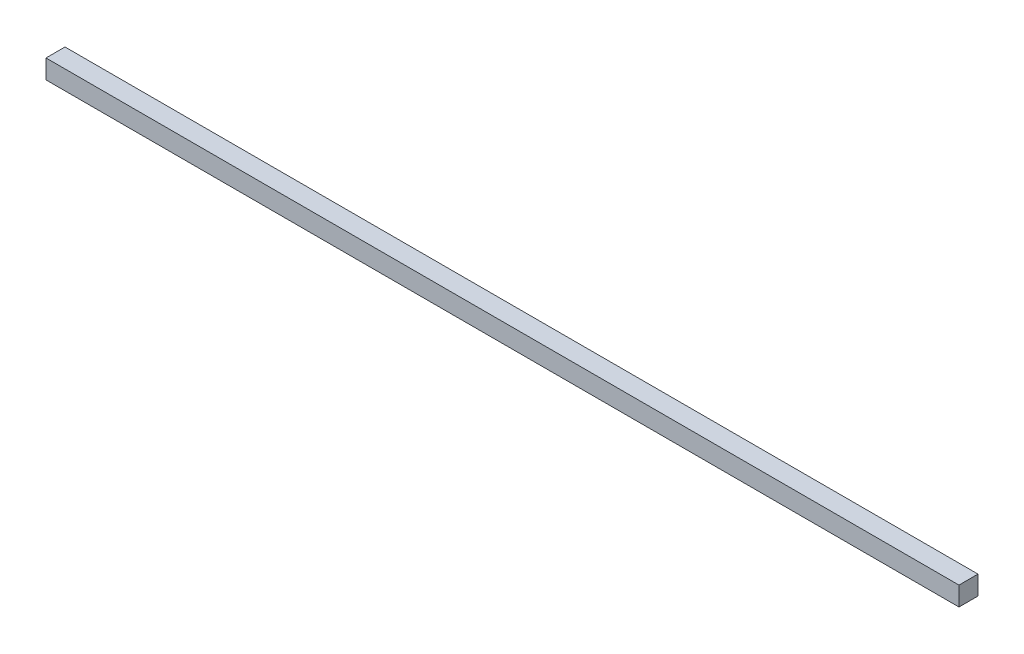
ISO-10303-21;
HEADER;
FILE_DESCRIPTION(('STEP AP214'),'2;1');
FILE_NAME('part.step','',(''),(''),'','','');
FILE_SCHEMA(('AUTOMOTIVE_DESIGN { 1 0 10303 214 1 1 1 1 }'));
ENDSEC;
DATA;
#1=APPLICATION_CONTEXT('core data for automotive mechanical design processes');
#2=APPLICATION_PROTOCOL_DEFINITION('international standard','automotive_design',2000,#1);
#3=PRODUCT_CONTEXT('',#1,'mechanical');
#4=PRODUCT('Part','Part','',(#3));
#5=PRODUCT_RELATED_PRODUCT_CATEGORY('part','',(#4));
#6=PRODUCT_DEFINITION_FORMATION('','',#4);
#7=PRODUCT_DEFINITION_CONTEXT('part definition',#1,'design');
#8=PRODUCT_DEFINITION('design','',#6,#7);
#9=PRODUCT_DEFINITION_SHAPE('','',#8);
#10=(LENGTH_UNIT() NAMED_UNIT(*) SI_UNIT(.MILLI.,.METRE.));
#11=(NAMED_UNIT(*) PLANE_ANGLE_UNIT() SI_UNIT($,.RADIAN.));
#12=(NAMED_UNIT(*) SI_UNIT($,.STERADIAN.) SOLID_ANGLE_UNIT());
#13=UNCERTAINTY_MEASURE_WITH_UNIT(LENGTH_MEASURE(1.E-05),#10,'distance_accuracy_value','');
#14=(GEOMETRIC_REPRESENTATION_CONTEXT(3) GLOBAL_UNCERTAINTY_ASSIGNED_CONTEXT((#13)) GLOBAL_UNIT_ASSIGNED_CONTEXT((#10,
#11,#12)) REPRESENTATION_CONTEXT('',''));
#15=CARTESIAN_POINT('',(0.,0.,0.));
#16=DIRECTION('',(0.,0.,1.));
#17=DIRECTION('',(1.,0.,0.));
#18=AXIS2_PLACEMENT_3D('',#15,#16,#17);
#19=CARTESIAN_POINT('',(0.,57.9960707269154,30.));
#20=DIRECTION('',(1.,0.,0.));
#21=DIRECTION('',(0.,1.,0.));
#22=AXIS2_PLACEMENT_3D('',#19,#20,#21);
#23=PLANE('',#22);
#24=DIRECTION('',(0.,-1.,0.));
#25=VECTOR('',#24,1.);
#26=CARTESIAN_POINT('',(0.,57.9960707269154,0.));
#27=LINE('',#26,#25);
#28=CARTESIAN_POINT('',(0.,57.9960707269154,0.));
#29=VERTEX_POINT('',#28);
#30=CARTESIAN_POINT('',(0.,27.9960707269154,0.));
#31=VERTEX_POINT('',#30);
#32=EDGE_CURVE('E107',#29,#31,#27,.T.);
#33=ORIENTED_EDGE('',*,*,#32,.T.);
#34=DIRECTION('',(0.,0.,-1.));
#35=VECTOR('',#34,1.);
#36=CARTESIAN_POINT('',(0.,27.9960707269154,30.));
#37=LINE('',#36,#35);
#38=CARTESIAN_POINT('',(0.,27.9960707269154,30.));
#39=VERTEX_POINT('',#38);
#40=EDGE_CURVE('E11',#39,#31,#37,.T.);
#41=ORIENTED_EDGE('',*,*,#40,.F.);
#42=DIRECTION('',(0.,-1.,0.));
#43=VECTOR('',#42,1.);
#44=CARTESIAN_POINT('',(0.,57.9960707269154,30.));
#45=LINE('',#44,#43);
#46=CARTESIAN_POINT('',(0.,57.9960707269154,30.));
#47=VERTEX_POINT('',#46);
#48=EDGE_CURVE('E91',#47,#39,#45,.T.);
#49=ORIENTED_EDGE('',*,*,#48,.F.);
#50=DIRECTION('',(0.,0.,-1.));
#51=VECTOR('',#50,1.);
#52=CARTESIAN_POINT('',(0.,57.9960707269154,30.));
#53=LINE('',#52,#51);
#54=EDGE_CURVE('E103',#47,#29,#53,.T.);
#55=ORIENTED_EDGE('',*,*,#54,.T.);
#56=EDGE_LOOP('',(#33,#41,#49,#55));
#57=FACE_BOUND('',#56,.T.);
#58=ADVANCED_FACE('F39',(#57),#23,.F.);
#59=CARTESIAN_POINT('',(0.,27.9960707269154,30.));
#60=DIRECTION('',(0.,1.,0.));
#61=DIRECTION('',(0.,0.,1.));
#62=AXIS2_PLACEMENT_3D('',#59,#60,#61);
#63=PLANE('',#62);
#64=DIRECTION('',(1.,0.,0.));
#65=VECTOR('',#64,1.);
#66=CARTESIAN_POINT('',(0.,27.9960707269154,0.));
#67=LINE('',#66,#65);
#68=CARTESIAN_POINT('',(1440.,27.9960707269154,0.));
#69=VERTEX_POINT('',#68);
#70=EDGE_CURVE('E96',#31,#69,#67,.T.);
#71=ORIENTED_EDGE('',*,*,#70,.T.);
#72=DIRECTION('',(0.,0.,-1.));
#73=VECTOR('',#72,1.);
#74=CARTESIAN_POINT('',(1440.,27.9960707269154,30.));
#75=LINE('',#74,#73);
#76=CARTESIAN_POINT('',(1440.,27.9960707269154,30.));
#77=VERTEX_POINT('',#76);
#78=EDGE_CURVE('E48',#77,#69,#75,.T.);
#79=ORIENTED_EDGE('',*,*,#78,.F.);
#80=DIRECTION('',(1.,0.,0.));
#81=VECTOR('',#80,1.);
#82=CARTESIAN_POINT('',(0.,27.9960707269154,30.));
#83=LINE('',#82,#81);
#84=EDGE_CURVE('E86',#39,#77,#83,.T.);
#85=ORIENTED_EDGE('',*,*,#84,.F.);
#86=ORIENTED_EDGE('',*,*,#40,.T.);
#87=EDGE_LOOP('',(#71,#79,#85,#86));
#88=FACE_BOUND('',#87,.T.);
#89=ADVANCED_FACE('F95',(#88),#63,.F.);
#90=CARTESIAN_POINT('',(1440.,57.9960707269154,30.));
#91=DIRECTION('',(-1.,0.,0.));
#92=DIRECTION('',(0.,0.,1.));
#93=AXIS2_PLACEMENT_3D('',#90,#91,#92);
#94=PLANE('',#93);
#95=DIRECTION('',(0.,1.,0.));
#96=VECTOR('',#95,1.);
#97=CARTESIAN_POINT('',(1440.,57.9960707269154,0.));
#98=LINE('',#97,#96);
#99=CARTESIAN_POINT('',(1440.,57.9960707269154,0.));
#100=VERTEX_POINT('',#99);
#101=EDGE_CURVE('E73',#69,#100,#98,.T.);
#102=ORIENTED_EDGE('',*,*,#101,.T.);
#103=DIRECTION('',(0.,0.,-1.));
#104=VECTOR('',#103,1.);
#105=CARTESIAN_POINT('',(1440.,57.9960707269154,30.));
#106=LINE('',#105,#104);
#107=CARTESIAN_POINT('',(1440.,57.9960707269154,30.));
#108=VERTEX_POINT('',#107);
#109=EDGE_CURVE('E98',#108,#100,#106,.T.);
#110=ORIENTED_EDGE('',*,*,#109,.F.);
#111=DIRECTION('',(0.,1.,0.));
#112=VECTOR('',#111,1.);
#113=CARTESIAN_POINT('',(1440.,57.9960707269154,30.));
#114=LINE('',#113,#112);
#115=EDGE_CURVE('E89',#77,#108,#114,.T.);
#116=ORIENTED_EDGE('',*,*,#115,.F.);
#117=ORIENTED_EDGE('',*,*,#78,.T.);
#118=EDGE_LOOP('',(#102,#110,#116,#117));
#119=FACE_BOUND('',#118,.T.);
#120=ADVANCED_FACE('F99',(#119),#94,.F.);
#121=CARTESIAN_POINT('',(0.,57.9960707269154,30.));
#122=DIRECTION('',(0.,-1.,0.));
#123=DIRECTION('',(0.,0.,-1.));
#124=AXIS2_PLACEMENT_3D('',#121,#122,#123);
#125=PLANE('',#124);
#126=DIRECTION('',(-1.,0.,0.));
#127=VECTOR('',#126,1.);
#128=CARTESIAN_POINT('',(0.,57.9960707269154,0.));
#129=LINE('',#128,#127);
#130=EDGE_CURVE('E79',#100,#29,#129,.T.);
#131=ORIENTED_EDGE('',*,*,#130,.T.);
#132=ORIENTED_EDGE('',*,*,#54,.F.);
#133=DIRECTION('',(-1.,0.,0.));
#134=VECTOR('',#133,1.);
#135=CARTESIAN_POINT('',(0.,57.9960707269154,30.));
#136=LINE('',#135,#134);
#137=EDGE_CURVE('E56',#108,#47,#136,.T.);
#138=ORIENTED_EDGE('',*,*,#137,.F.);
#139=ORIENTED_EDGE('',*,*,#109,.T.);
#140=EDGE_LOOP('',(#131,#132,#138,#139));
#141=FACE_BOUND('',#140,.T.);
#142=ADVANCED_FACE('F120',(#141),#125,.F.);
#143=CARTESIAN_POINT('',(0.,0.,30.));
#144=DIRECTION('',(0.,0.,1.));
#145=DIRECTION('',(1.,0.,0.));
#146=AXIS2_PLACEMENT_3D('',#143,#144,#145);
#147=PLANE('',#146);
#148=ORIENTED_EDGE('',*,*,#48,.T.);
#149=ORIENTED_EDGE('',*,*,#84,.T.);
#150=ORIENTED_EDGE('',*,*,#115,.T.);
#151=ORIENTED_EDGE('',*,*,#137,.T.);
#152=EDGE_LOOP('',(#148,#149,#150,#151));
#153=FACE_BOUND('',#152,.T.);
#154=ADVANCED_FACE('F87',(#153),#147,.T.);
#155=CARTESIAN_POINT('',(0.,0.,0.));
#156=DIRECTION('',(0.,0.,1.));
#157=DIRECTION('',(1.,0.,0.));
#158=AXIS2_PLACEMENT_3D('',#155,#156,#157);
#159=PLANE('',#158);
#160=ORIENTED_EDGE('',*,*,#32,.F.);
#161=ORIENTED_EDGE('',*,*,#130,.F.);
#162=ORIENTED_EDGE('',*,*,#101,.F.);
#163=ORIENTED_EDGE('',*,*,#70,.F.);
#164=EDGE_LOOP('',(#160,#161,#162,#163));
#165=FACE_BOUND('',#164,.T.);
#166=ADVANCED_FACE('F123',(#165),#159,.F.);
#167=CLOSED_SHELL('',(#58,#89,#120,#142,#154,#166));
#168=MANIFOLD_SOLID_BREP('B2',#167);
#169=ADVANCED_BREP_SHAPE_REPRESENTATION('',(#18,#168),#14);
#170=SHAPE_DEFINITION_REPRESENTATION(#9,#169);
ENDSEC;
END-ISO-10303-21;
